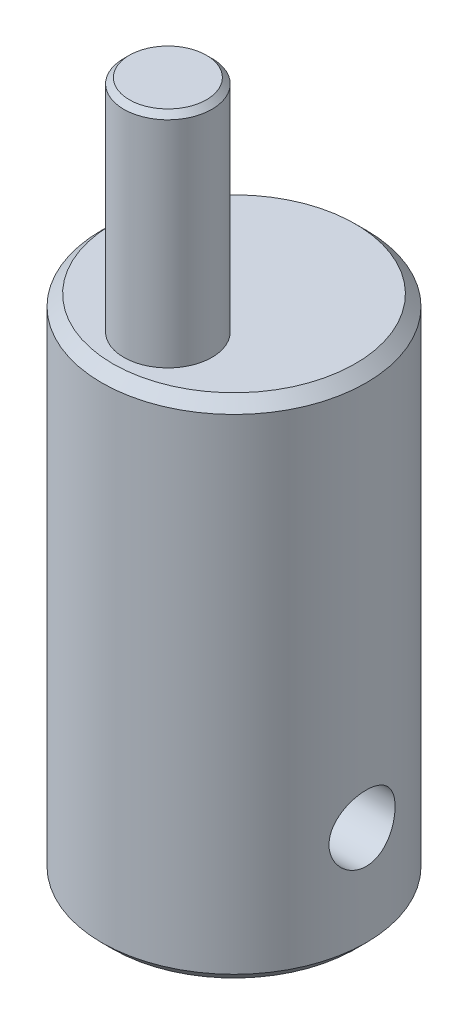
ISO-10303-21;
HEADER;
FILE_DESCRIPTION(('STEP AP214'),'2;1');
FILE_NAME('part.step','',(''),(''),'','','');
FILE_SCHEMA(('AUTOMOTIVE_DESIGN { 1 0 10303 214 1 1 1 1 }'));
ENDSEC;
DATA;
#1=APPLICATION_CONTEXT('core data for automotive mechanical design processes');
#2=APPLICATION_PROTOCOL_DEFINITION('international standard','automotive_design',2000,#1);
#3=PRODUCT_CONTEXT('',#1,'mechanical');
#4=PRODUCT('Part','Part','',(#3));
#5=PRODUCT_RELATED_PRODUCT_CATEGORY('part','',(#4));
#6=PRODUCT_DEFINITION_FORMATION('','',#4);
#7=PRODUCT_DEFINITION_CONTEXT('part definition',#1,'design');
#8=PRODUCT_DEFINITION('design','',#6,#7);
#9=PRODUCT_DEFINITION_SHAPE('','',#8);
#10=(LENGTH_UNIT() NAMED_UNIT(*) SI_UNIT(.MILLI.,.METRE.));
#11=(NAMED_UNIT(*) PLANE_ANGLE_UNIT() SI_UNIT($,.RADIAN.));
#12=(NAMED_UNIT(*) SI_UNIT($,.STERADIAN.) SOLID_ANGLE_UNIT());
#13=UNCERTAINTY_MEASURE_WITH_UNIT(LENGTH_MEASURE(1.E-05),#10,'distance_accuracy_value','');
#14=(GEOMETRIC_REPRESENTATION_CONTEXT(3) GLOBAL_UNCERTAINTY_ASSIGNED_CONTEXT((#13)) GLOBAL_UNIT_ASSIGNED_CONTEXT((#10,
#11,#12)) REPRESENTATION_CONTEXT('',''));
#15=CARTESIAN_POINT('',(0.,0.,0.));
#16=DIRECTION('',(0.,0.,1.));
#17=DIRECTION('',(1.,0.,0.));
#18=AXIS2_PLACEMENT_3D('',#15,#16,#17);
#19=CARTESIAN_POINT('',(0.,23.,0.));
#20=DIRECTION('',(0.,-1.,0.));
#21=DIRECTION('',(0.,0.,-1.));
#22=AXIS2_PLACEMENT_3D('',#19,#20,#21);
#23=CYLINDRICAL_SURFACE('',#22,6.);
#24=CARTESIAN_POINT('',(0.,0.5,0.));
#25=DIRECTION('',(0.,1.,0.));
#26=DIRECTION('',(0.,0.,1.));
#27=AXIS2_PLACEMENT_3D('',#24,#25,#26);
#28=CIRCLE('',#27,6.);
#29=CARTESIAN_POINT('',(0.,0.5,6.));
#30=VERTEX_POINT('',#29);
#31=EDGE_CURVE('E55',#30,#30,#28,.T.);
#32=ORIENTED_EDGE('',*,*,#31,.T.);
#33=EDGE_LOOP('',(#32));
#34=FACE_BOUND('',#33,.T.);
#35=CARTESIAN_POINT('',(0.,22.5,0.));
#36=DIRECTION('',(0.,1.,0.));
#37=DIRECTION('',(0.,0.,1.));
#38=AXIS2_PLACEMENT_3D('',#35,#36,#37);
#39=CIRCLE('',#38,6.);
#40=CARTESIAN_POINT('',(0.,22.5,6.));
#41=VERTEX_POINT('',#40);
#42=EDGE_CURVE('E59',#41,#41,#39,.F.);
#43=ORIENTED_EDGE('',*,*,#42,.T.);
#44=EDGE_LOOP('',(#43));
#45=FACE_BOUND('',#44,.T.);
#46=CARTESIAN_POINT('',(-6.,3.5,0.));
#47=CARTESIAN_POINT('',(-5.99999859868013,3.50000232573816,-0.0828760886697311));
#48=CARTESIAN_POINT('',(-5.99826578131828,3.50689155077379,-0.165778157830763));
#49=CARTESIAN_POINT('',(-5.99152113829892,3.534225151307,-0.329206323770533));
#50=CARTESIAN_POINT('',(-5.98650745419968,3.55467720953785,-0.409731046870739));
#51=CARTESIAN_POINT('',(-5.9737562633204,3.60843925346209,-0.566020872182577));
#52=CARTESIAN_POINT('',(-5.96602202842087,3.64173379871528,-0.641791563430003));
#53=CARTESIAN_POINT('',(-5.94865343807593,3.72018139004483,-0.786672131904427));
#54=CARTESIAN_POINT('',(-5.9390190185405,3.76533483611894,-0.855781784348759));
#55=CARTESIAN_POINT('',(-5.91867413591801,3.86720078965421,-0.98680192730092));
#56=CARTESIAN_POINT('',(-5.90794707148533,3.92411157495918,-1.04855569006107));
#57=CARTESIAN_POINT('',(-5.8867362011753,4.04745220490892,-1.1617489272033));
#58=CARTESIAN_POINT('',(-5.87625242288348,4.1138831229465,-1.21318723694913));
#59=CARTESIAN_POINT('',(-5.8565477569971,4.25559522673744,-1.30502654279903));
#60=CARTESIAN_POINT('',(-5.84734794470605,4.3309932308104,-1.34525221592536));
#61=CARTESIAN_POINT('',(-5.83149494812223,4.48774841165836,-1.41239690855053));
#62=CARTESIAN_POINT('',(-5.82484135672789,4.56910463332576,-1.43931805543933));
#63=CARTESIAN_POINT('',(-5.81500476717551,4.73374349820247,-1.47855483680429));
#64=CARTESIAN_POINT('',(-5.81175491075426,4.8169548960498,-1.49115226833334));
#65=CARTESIAN_POINT('',(-5.80889362537741,4.98436856901398,-1.50226177506785));
#66=CARTESIAN_POINT('',(-5.80928160448644,5.06857068069861,-1.50077614181798));
#67=CARTESIAN_POINT('',(-5.81359205496618,5.23341580774448,-1.48398652463928));
#68=CARTESIAN_POINT('',(-5.81742863001879,5.3140956214651,-1.46901834019052));
#69=CARTESIAN_POINT('',(-5.82806709676484,5.47176105091129,-1.42622418690311));
#70=CARTESIAN_POINT('',(-5.83486919970696,5.54874640302898,-1.39839730206942));
#71=CARTESIAN_POINT('',(-5.85075113904187,5.69773801625207,-1.33038947793715));
#72=CARTESIAN_POINT('',(-5.85985327469421,5.76968617178955,-1.29008666723291));
#73=CARTESIAN_POINT('',(-5.87929710846386,5.90591870975684,-1.19835627601495));
#74=CARTESIAN_POINT('',(-5.88963902334735,5.97020174806726,-1.14692674880884));
#75=CARTESIAN_POINT('',(-5.91075880539781,6.0912036156944,-1.03266342468122));
#76=CARTESIAN_POINT('',(-5.92154069477971,6.14765449006135,-0.96954625816586));
#77=CARTESIAN_POINT('',(-5.94205965578786,6.2492212424639,-0.8346119175037));
#78=CARTESIAN_POINT('',(-5.95179669549415,6.29433677426357,-0.762794477707944));
#79=CARTESIAN_POINT('',(-5.96917732094183,6.37205058622439,-0.612115888681392));
#80=CARTESIAN_POINT('',(-5.97681360127725,6.40460534025443,-0.533231393208624));
#81=CARTESIAN_POINT('',(-5.98907916991419,6.45591730570957,-0.370876008142883));
#82=CARTESIAN_POINT('',(-5.99370903339281,6.47467715641814,-0.287405999150485));
#83=CARTESIAN_POINT('',(-5.99935499271375,6.49745756555884,-0.120539970390027));
#84=CARTESIAN_POINT('',(-6.00046053508279,6.5018430260753,-0.0371967199882103));
#85=CARTESIAN_POINT('',(-5.99918804814451,6.49675099794451,0.129032874801507));
#86=CARTESIAN_POINT('',(-5.99681033241847,6.48727475720087,0.211919259644594));
#87=CARTESIAN_POINT('',(-5.98889581127357,6.45502909160862,0.373614268776491));
#88=CARTESIAN_POINT('',(-5.98340634185811,6.43245873652301,0.452465118968754));
#89=CARTESIAN_POINT('',(-5.96988706634134,6.37489291597155,0.605257292452511));
#90=CARTESIAN_POINT('',(-5.96185700369892,6.33989619568683,0.679198119032634));
#91=CARTESIAN_POINT('',(-5.94393307926311,6.25776387112527,0.821523134429847));
#92=CARTESIAN_POINT('',(-5.93400867366932,6.21042388760324,0.88978544183583));
#93=CARTESIAN_POINT('',(-5.91344509187419,6.10521009120303,1.01752661364325));
#94=CARTESIAN_POINT('',(-5.90280579251705,6.04733446038309,1.07700395897301));
#95=CARTESIAN_POINT('',(-5.88168956960771,5.92099803915554,1.18699056807273));
#96=CARTESIAN_POINT('',(-5.87122304187281,5.85231229699758,1.23724386762203));
#97=CARTESIAN_POINT('',(-5.85192878377239,5.70726736553428,1.3255107590127));
#98=CARTESIAN_POINT('',(-5.84310098067026,5.63090851704025,1.36352489415794));
#99=CARTESIAN_POINT('',(-5.82818094734665,5.47309427758692,1.42595142060929));
#100=CARTESIAN_POINT('',(-5.82207255291906,5.39167237165599,1.45044439665406));
#101=CARTESIAN_POINT('',(-5.81326744090184,5.22569036211089,1.48534565995378));
#102=CARTESIAN_POINT('',(-5.81056997719936,5.14113094896751,1.49575702747866));
#103=CARTESIAN_POINT('',(-5.80894901203957,4.9738789761448,1.50203859033399));
#104=CARTESIAN_POINT('',(-5.80991932728264,4.89120256487527,1.49831789778012));
#105=CARTESIAN_POINT('',(-5.81527909007843,4.72769611133202,1.47737727831287));
#106=CARTESIAN_POINT('',(-5.81966846891857,4.64686603198635,1.46015762268677));
#107=CARTESIAN_POINT('',(-5.83131260682722,4.48979154093459,1.41293131944279));
#108=CARTESIAN_POINT('',(-5.83855015236309,4.41352269475979,1.38300140468038));
#109=CARTESIAN_POINT('',(-5.85507755724829,4.26703461728631,1.31126491360507));
#110=CARTESIAN_POINT('',(-5.86436770120773,4.19681622681309,1.26945669003419));
#111=CARTESIAN_POINT('',(-5.88425634263512,4.06244537099798,1.17386774863714));
#112=CARTESIAN_POINT('',(-5.89488264831757,3.99849892657604,1.11980316291226));
#113=CARTESIAN_POINT('',(-5.91608027246286,3.88045295520459,1.00178937118974));
#114=CARTESIAN_POINT('',(-5.9266515772706,3.82635576988703,0.937837821261146));
#115=CARTESIAN_POINT('',(-5.94677655647663,3.72858869143539,0.800467586702591));
#116=CARTESIAN_POINT('',(-5.95630833365868,3.68512538632842,0.726898422316388));
#117=CARTESIAN_POINT('',(-5.97304924975118,3.61125253705947,0.573266059510477));
#118=CARTESIAN_POINT('',(-5.98026005199781,3.58083363935146,0.49320756343674));
#119=CARTESIAN_POINT('',(-5.99048059565542,3.53842816967035,0.344410253243472));
#120=CARTESIAN_POINT('',(-5.99402585052691,3.52404875694657,0.276380170908069));
#121=CARTESIAN_POINT('',(-5.99878605231948,3.50483405637806,0.138906071536283));
#122=CARTESIAN_POINT('',(-6.00000117450894,3.4999980506947,0.0694621612426164));
#123=CARTESIAN_POINT('',(-6.,3.5,0.));
#124=B_SPLINE_CURVE_WITH_KNOTS('',3,(#46,#47,#48,#49,#50,#51,#52,#53,#54,#55,#56,#57,#58,#59,
#60,#61,#62,#63,#64,#65,#66,#67,#68,#69,#70,#71,#72,#73,#74,#75,#76,#77,#78,#79,#80,#81,#82,#83,
#84,#85,#86,#87,#88,#89,#90,#91,#92,#93,#94,#95,#96,#97,#98,#99,#100,#101,#102,#103,#104,#105,
#106,#107,#108,#109,#110,#111,#112,#113,#114,#115,#116,#117,#118,#119,#120,#121,#122,#123),
.UNSPECIFIED.,.T.,.F.,(4,2,2,2,2,2,2,2,2,2,2,2,2,2,2,2,2,2,2,2,2,2,2,2,2,2,2,2,2,2,2,2,2,2,2,2,
2,2,4),(0.,0.24837371247189,0.4968882377639,0.745104902286106,0.993329940169329,
1.24614435437139,1.49898729580062,1.75558647545807,2.01214461169368,2.2635629509943,
2.51494038112697,2.76022497007018,3.00552703466038,3.25330527873879,3.50112690836163,
3.75601500969019,4.01091089558247,4.26668229009114,4.52240473688643,4.77158308949276,
5.02073901112743,5.26620274514037,5.5116912732229,5.76153587565352,6.01142363008019,
6.26744509204476,6.52345518749508,6.77792254614036,7.03233423252407,7.27943780398612,
7.52653640956034,7.77216400559447,8.01782568136901,8.2698957640991,8.52202569770417,
8.77872185499588,9.0352336382135,9.24342242942149,9.45159556043039),.UNSPECIFIED.);
#125=CARTESIAN_POINT('',(-6.,3.5,0.));
#126=VERTEX_POINT('',#125);
#127=EDGE_CURVE('E70',#126,#126,#124,.T.);
#128=ORIENTED_EDGE('',*,*,#127,.T.);
#129=EDGE_LOOP('',(#128));
#130=FACE_BOUND('',#129,.T.);
#131=CARTESIAN_POINT('',(5.80947501931113,5.,-1.5));
#132=CARTESIAN_POINT('',(5.80947660051185,4.91716954944523,-1.49999764715507));
#133=CARTESIAN_POINT('',(5.81126583608348,4.8343130607932,-1.49311574729838));
#134=CARTESIAN_POINT('',(5.81821117195949,4.67097945309558,-1.46581387527848));
#135=CARTESIAN_POINT('',(5.82336923173088,4.590503747319,-1.44538602404532));
#136=CARTESIAN_POINT('',(5.8364323475758,4.43431787708778,-1.39169471977917));
#137=CARTESIAN_POINT('',(5.84433385614245,4.3586017067686,-1.35844783671268));
#138=CARTESIAN_POINT('',(5.86198915217285,4.21381348847605,-1.28011268475685));
#139=CARTESIAN_POINT('',(5.87174301827101,4.14474172275187,-1.23502391313642));
#140=CARTESIAN_POINT('',(5.89224429813367,4.01368301284268,-1.13322505638713));
#141=CARTESIAN_POINT('',(5.90300758573818,3.95186383978997,-1.07630213262243));
#142=CARTESIAN_POINT('',(5.92417725309179,3.83854316338379,-0.952909238460399));
#143=CARTESIAN_POINT('',(5.93458359939834,3.78704262462695,-0.886438376508185));
#144=CARTESIAN_POINT('',(5.95404249312349,3.69513471942123,-0.744687120647373));
#145=CARTESIAN_POINT('',(5.96307412440355,3.65489216710312,-0.669296745717072));
#146=CARTESIAN_POINT('',(5.9785848715559,3.58771421350815,-0.512557910575657));
#147=CARTESIAN_POINT('',(5.98506436400607,3.56077684885069,-0.431210331475164));
#148=CARTESIAN_POINT('',(5.99462855308908,3.52151129925285,-0.266615255252497));
#149=CARTESIAN_POINT('',(5.99777936306589,3.50889821340405,-0.183439631729386));
#150=CARTESIAN_POINT('',(6.00056156464379,3.49774497243467,-0.0160972915576618));
#151=CARTESIAN_POINT('',(6.00019347658022,3.49920273667424,0.068069276722841));
#152=CARTESIAN_POINT('',(5.99602856972121,3.51594491015009,0.233028370758581));
#153=CARTESIAN_POINT('',(5.99230801404524,3.53092179503231,0.313854323401601));
#154=CARTESIAN_POINT('',(5.98194501914912,3.5737827620291,0.47180737112053));
#155=CARTESIAN_POINT('',(5.97530242439065,3.60166753122645,0.548934269055657));
#156=CARTESIAN_POINT('',(5.95972505820537,3.66980154241224,0.69811005525271));
#157=CARTESIAN_POINT('',(5.95077011817032,3.71016022679705,0.770106764649757));
#158=CARTESIAN_POINT('',(5.9315394228579,3.80201340746976,0.906413433510734));
#159=CARTESIAN_POINT('',(5.92126343791494,3.85350984113637,0.970722052628259));
#160=CARTESIAN_POINT('',(5.90018228261712,3.96782524518943,1.09166105262743));
#161=CARTESIAN_POINT('',(5.88937031715551,4.03091293540867,1.1480365186128));
#162=CARTESIAN_POINT('',(5.86869026110024,4.16575998412415,1.24946456394453));
#163=CARTESIAN_POINT('',(5.85882221463582,4.2375197476946,1.29451661406903));
#164=CARTESIAN_POINT('',(5.84112298098989,4.38817402048938,1.3721821935339));
#165=CARTESIAN_POINT('',(5.83330190235432,4.46710143818792,1.40473435045574));
#166=CARTESIAN_POINT('',(5.82071184083974,4.62955128084587,1.45602843095451));
#167=CARTESIAN_POINT('',(5.81594220486131,4.71307271838988,1.47477330982937));
#168=CARTESIAN_POINT('',(5.81013213623485,4.87997570091387,1.49749778319911));
#169=CARTESIAN_POINT('',(5.80899653456189,4.96330267599778,1.50185428435178));
#170=CARTESIAN_POINT('',(5.81032406088624,5.1294931619469,1.49671019430933));
#171=CARTESIAN_POINT('',(5.8127868576076,5.21235671477075,1.48721087870928));
#172=CARTESIAN_POINT('',(5.82094249172736,5.37386855897283,1.4549552783626));
#173=CARTESIAN_POINT('',(5.82658182140625,5.45256363594251,1.43241844096905));
#174=CARTESIAN_POINT('',(5.84040430962578,5.60505887471101,1.37497084900237));
#175=CARTESIAN_POINT('',(5.84858776949168,5.6788584554332,1.34005862862753));
#176=CARTESIAN_POINT('',(5.86677682255958,5.82106476672041,1.25806240076193));
#177=CARTESIAN_POINT('',(5.87681501163985,5.88933730402586,1.21075305230138));
#178=CARTESIAN_POINT('',(5.8975024984303,6.01711301768081,1.10559043940168));
#179=CARTESIAN_POINT('',(5.90815189637082,6.07661474999004,1.04773544220816));
#180=CARTESIAN_POINT('',(5.92918441818964,6.18668662554257,0.921394081477089));
#181=CARTESIAN_POINT('',(5.93955421237101,6.23699603752929,0.852677928797389));
#182=CARTESIAN_POINT('',(5.95858329968241,6.32536152017075,0.707554024042013));
#183=CARTESIAN_POINT('',(5.96724268202376,6.36341822996492,0.631146673436387));
#184=CARTESIAN_POINT('',(5.98182069442989,6.42586762071676,0.473337302596635));
#185=CARTESIAN_POINT('',(5.98775898013446,6.45035857062744,0.391976071541822));
#186=CARTESIAN_POINT('',(5.99631176037473,6.48527620076505,0.226124640478212));
#187=CARTESIAN_POINT('',(5.99892689636045,6.49570559524343,0.141635047561865));
#188=CARTESIAN_POINT('',(6.00051254113217,6.5020513843633,-0.0256252896649896));
#189=CARTESIAN_POINT('',(5.99957968320012,6.49835256364309,-0.10838074044905));
#190=CARTESIAN_POINT('',(5.99438844686135,6.4774282590585,-0.272051244622109));
#191=CARTESIAN_POINT('',(5.99013016735643,6.46020317748035,-0.35296635267133));
#192=CARTESIAN_POINT('',(5.97878149280944,6.41292167034361,-0.510256553467225));
#193=CARTESIAN_POINT('',(5.97170646753999,6.38293482002806,-0.586653741871529));
#194=CARTESIAN_POINT('',(5.95546933370076,6.31104413147101,-0.733375579562203));
#195=CARTESIAN_POINT('',(5.94630696206604,6.26913879099565,-0.803699461897578));
#196=CARTESIAN_POINT('',(5.92660874521999,6.17342714900439,-0.93810289263585));
#197=CARTESIAN_POINT('',(5.91604525418417,6.11935978563893,-1.00199248245088));
#198=CARTESIAN_POINT('',(5.89485973579863,6.0013657220393,-1.11992253040688));
#199=CARTESIAN_POINT('',(5.88423769428834,5.93743652585314,-1.17396048760228));
#200=CARTESIAN_POINT('',(5.86391213790822,5.800097878698,-1.27164303971884));
#201=CARTESIAN_POINT('',(5.85422945594827,5.72653381488106,-1.31507492916982));
#202=CARTESIAN_POINT('',(5.83715933325924,5.57291676511595,-1.3888903449235));
#203=CARTESIAN_POINT('',(5.82977022370054,5.49286855083989,-1.41928336463958));
#204=CARTESIAN_POINT('',(5.81927863109675,5.34413448225992,-1.46163379284816));
#205=CARTESIAN_POINT('',(5.8156299450082,5.27616025342421,-1.47598975589307));
#206=CARTESIAN_POINT('',(5.81072757878358,5.13879669650005,-1.4951734388599));
#207=CARTESIAN_POINT('',(5.80947369434945,5.06940748963241,-1.50000197155828));
#208=CARTESIAN_POINT('',(5.80947501931113,5.,-1.5));
#209=B_SPLINE_CURVE_WITH_KNOTS('',3,(#131,#132,#133,#134,#135,#136,#137,#138,#139,#140,#141,
#142,#143,#144,#145,#146,#147,#148,#149,#150,#151,#152,#153,#154,#155,#156,#157,#158,#159,#160,
#161,#162,#163,#164,#165,#166,#167,#168,#169,#170,#171,#172,#173,#174,#175,#176,#177,#178,#179,
#180,#181,#182,#183,#184,#185,#186,#187,#188,#189,#190,#191,#192,#193,#194,#195,#196,#197,#198,
#199,#200,#201,#202,#203,#204,#205,#206,#207,#208),.UNSPECIFIED.,.T.,.F.,(4,2,2,2,2,2,2,2,2,2,2,
2,2,2,2,2,2,2,2,2,2,2,2,2,2,2,2,2,2,2,2,2,2,2,2,2,2,2,4),(0.,0.248236465041681,0.4966174448572,
0.744678436299612,0.99274996053287,1.24574372515786,1.4987611288792,1.75530897838752,
2.01181895908255,2.26313250597208,2.51440889199612,2.76010957613368,3.00582334034872,
3.25375724552667,3.50173431281348,3.75642279943147,4.01112318719881,4.26705859205042,
4.52293920077729,4.7720614485703,5.02116076310281,5.26618443005524,5.5112371285285,
5.76109707515494,6.01099811331027,6.26715198579191,6.52329249431732,6.77755243684158,
7.03176329345423,7.27910067676474,7.52643070426189,7.77242925935827,8.01845883442843,
8.27038257949243,8.52237018939306,8.77905886370806,9.03556032819972,9.24358696306398,
9.45159585059713),.UNSPECIFIED.);
#210=CARTESIAN_POINT('',(5.80947501931113,5.,-1.5));
#211=VERTEX_POINT('',#210);
#212=EDGE_CURVE('E78',#211,#211,#209,.T.);
#213=ORIENTED_EDGE('',*,*,#212,.T.);
#214=EDGE_LOOP('',(#213));
#215=FACE_BOUND('',#214,.T.);
#216=ADVANCED_FACE('F43',(#34,#45,#130,#215),#23,.T.);
#217=CARTESIAN_POINT('',(0.,23.,0.));
#218=DIRECTION('',(0.,1.,0.));
#219=DIRECTION('',(0.,0.,1.));
#220=AXIS2_PLACEMENT_3D('',#217,#218,#219);
#221=PLANE('',#220);
#222=CARTESIAN_POINT('',(0.,23.,0.));
#223=DIRECTION('',(0.,1.,0.));
#224=DIRECTION('',(0.,0.,1.));
#225=AXIS2_PLACEMENT_3D('',#222,#223,#224);
#226=CIRCLE('',#225,5.49999999999999);
#227=CARTESIAN_POINT('',(0.,23.,5.49999999999999));
#228=VERTEX_POINT('',#227);
#229=EDGE_CURVE('E10',#228,#228,#226,.T.);
#230=ORIENTED_EDGE('',*,*,#229,.T.);
#231=EDGE_LOOP('',(#230));
#232=FACE_BOUND('',#231,.T.);
#233=CARTESIAN_POINT('',(0.,23.,3.));
#234=DIRECTION('',(0.,1.,0.));
#235=DIRECTION('',(0.,0.,1.));
#236=AXIS2_PLACEMENT_3D('',#233,#234,#235);
#237=CIRCLE('',#236,2.);
#238=CARTESIAN_POINT('',(0.,23.,5.));
#239=VERTEX_POINT('',#238);
#240=EDGE_CURVE('E121',#239,#239,#237,.T.);
#241=ORIENTED_EDGE('',*,*,#240,.F.);
#242=EDGE_LOOP('',(#241));
#243=FACE_BOUND('',#242,.T.);
#244=ADVANCED_FACE('F102',(#232,#243),#221,.T.);
#245=CARTESIAN_POINT('',(0.,0.,0.));
#246=DIRECTION('',(0.,1.,0.));
#247=DIRECTION('',(0.,0.,1.));
#248=AXIS2_PLACEMENT_3D('',#245,#246,#247);
#249=PLANE('',#248);
#250=CARTESIAN_POINT('',(0.,0.,0.));
#251=DIRECTION('',(0.,1.,0.));
#252=DIRECTION('',(0.,0.,1.));
#253=AXIS2_PLACEMENT_3D('',#250,#251,#252);
#254=CIRCLE('',#253,5.5);
#255=CARTESIAN_POINT('',(0.,0.,5.5));
#256=VERTEX_POINT('',#255);
#257=EDGE_CURVE('E51',#256,#256,#254,.F.);
#258=ORIENTED_EDGE('',*,*,#257,.T.);
#259=EDGE_LOOP('',(#258));
#260=FACE_BOUND('',#259,.T.);
#261=ADVANCED_FACE('F100',(#260),#249,.F.);
#262=CARTESIAN_POINT('',(0.,33.,3.));
#263=DIRECTION('',(0.,-1.,0.));
#264=DIRECTION('',(0.,0.,-1.));
#265=AXIS2_PLACEMENT_3D('',#262,#263,#264);
#266=CYLINDRICAL_SURFACE('',#265,2.);
#267=CARTESIAN_POINT('',(0.,32.75,3.));
#268=DIRECTION('',(0.,1.,0.));
#269=DIRECTION('',(0.,0.,1.));
#270=AXIS2_PLACEMENT_3D('',#267,#268,#269);
#271=CIRCLE('',#270,2.);
#272=CARTESIAN_POINT('',(0.,32.75,5.));
#273=VERTEX_POINT('',#272);
#274=EDGE_CURVE('E64',#273,#273,#271,.F.);
#275=ORIENTED_EDGE('',*,*,#274,.T.);
#276=EDGE_LOOP('',(#275));
#277=FACE_BOUND('',#276,.T.);
#278=ORIENTED_EDGE('',*,*,#240,.T.);
#279=EDGE_LOOP('',(#278));
#280=FACE_BOUND('',#279,.T.);
#281=ADVANCED_FACE('F96',(#277,#280),#266,.T.);
#282=CARTESIAN_POINT('',(0.,33.,3.));
#283=DIRECTION('',(0.,1.,0.));
#284=DIRECTION('',(0.,0.,1.));
#285=AXIS2_PLACEMENT_3D('',#282,#283,#284);
#286=PLANE('',#285);
#287=CARTESIAN_POINT('',(0.,33.,3.));
#288=DIRECTION('',(0.,1.,0.));
#289=DIRECTION('',(0.,0.,1.));
#290=AXIS2_PLACEMENT_3D('',#287,#288,#289);
#291=CIRCLE('',#290,1.75000000000001);
#292=CARTESIAN_POINT('',(0.,33.,4.75000000000001));
#293=VERTEX_POINT('',#292);
#294=EDGE_CURVE('E67',#293,#293,#291,.T.);
#295=ORIENTED_EDGE('',*,*,#294,.T.);
#296=EDGE_LOOP('',(#295));
#297=FACE_BOUND('',#296,.T.);
#298=ADVANCED_FACE('F91',(#297),#286,.T.);
#299=CARTESIAN_POINT('',(-6.,5.,0.));
#300=DIRECTION('',(1.,0.,0.));
#301=DIRECTION('',(0.,0.,-1.));
#302=AXIS2_PLACEMENT_3D('',#299,#300,#301);
#303=CYLINDRICAL_SURFACE('',#302,1.5);
#304=ORIENTED_EDGE('',*,*,#212,.F.);
#305=EDGE_LOOP('',(#304));
#306=FACE_BOUND('',#305,.T.);
#307=ORIENTED_EDGE('',*,*,#127,.F.);
#308=EDGE_LOOP('',(#307));
#309=FACE_BOUND('',#308,.T.);
#310=ADVANCED_FACE('F86',(#306,#309),#303,.F.);
#311=CARTESIAN_POINT('',(0.,33.,3.));
#312=DIRECTION('',(0.,-1.,0.));
#313=DIRECTION('',(0.,0.,-1.));
#314=AXIS2_PLACEMENT_3D('',#311,#312,#313);
#315=CONICAL_SURFACE('',#314,1.75000000000001,0.785398163397438);
#316=ORIENTED_EDGE('',*,*,#274,.F.);
#317=EDGE_LOOP('',(#316));
#318=FACE_BOUND('',#317,.T.);
#319=ORIENTED_EDGE('',*,*,#294,.F.);
#320=EDGE_LOOP('',(#319));
#321=FACE_BOUND('',#320,.T.);
#322=ADVANCED_FACE('F90',(#318,#321),#315,.T.);
#323=CARTESIAN_POINT('',(0.,0.5,0.));
#324=DIRECTION('',(0.,1.,0.));
#325=DIRECTION('',(0.,0.,1.));
#326=AXIS2_PLACEMENT_3D('',#323,#324,#325);
#327=CONICAL_SURFACE('',#326,6.,0.785398163397454);
#328=ORIENTED_EDGE('',*,*,#257,.F.);
#329=EDGE_LOOP('',(#328));
#330=FACE_BOUND('',#329,.T.);
#331=ORIENTED_EDGE('',*,*,#31,.F.);
#332=EDGE_LOOP('',(#331));
#333=FACE_BOUND('',#332,.T.);
#334=ADVANCED_FACE('F130',(#330,#333),#327,.T.);
#335=CARTESIAN_POINT('',(0.,23.,0.));
#336=DIRECTION('',(0.,-1.,0.));
#337=DIRECTION('',(0.,0.,-1.));
#338=AXIS2_PLACEMENT_3D('',#335,#336,#337);
#339=CONICAL_SURFACE('',#338,5.49999999999999,0.785398163397447);
#340=ORIENTED_EDGE('',*,*,#42,.F.);
#341=EDGE_LOOP('',(#340));
#342=FACE_BOUND('',#341,.T.);
#343=ORIENTED_EDGE('',*,*,#229,.F.);
#344=EDGE_LOOP('',(#343));
#345=FACE_BOUND('',#344,.T.);
#346=ADVANCED_FACE('F46',(#342,#345),#339,.T.);
#347=CLOSED_SHELL('',(#216,#244,#261,#281,#298,#310,#322,#334,#346));
#348=MANIFOLD_SOLID_BREP('B2',#347);
#349=ADVANCED_BREP_SHAPE_REPRESENTATION('',(#18,#348),#14);
#350=SHAPE_DEFINITION_REPRESENTATION(#9,#349);
ENDSEC;
END-ISO-10303-21;
